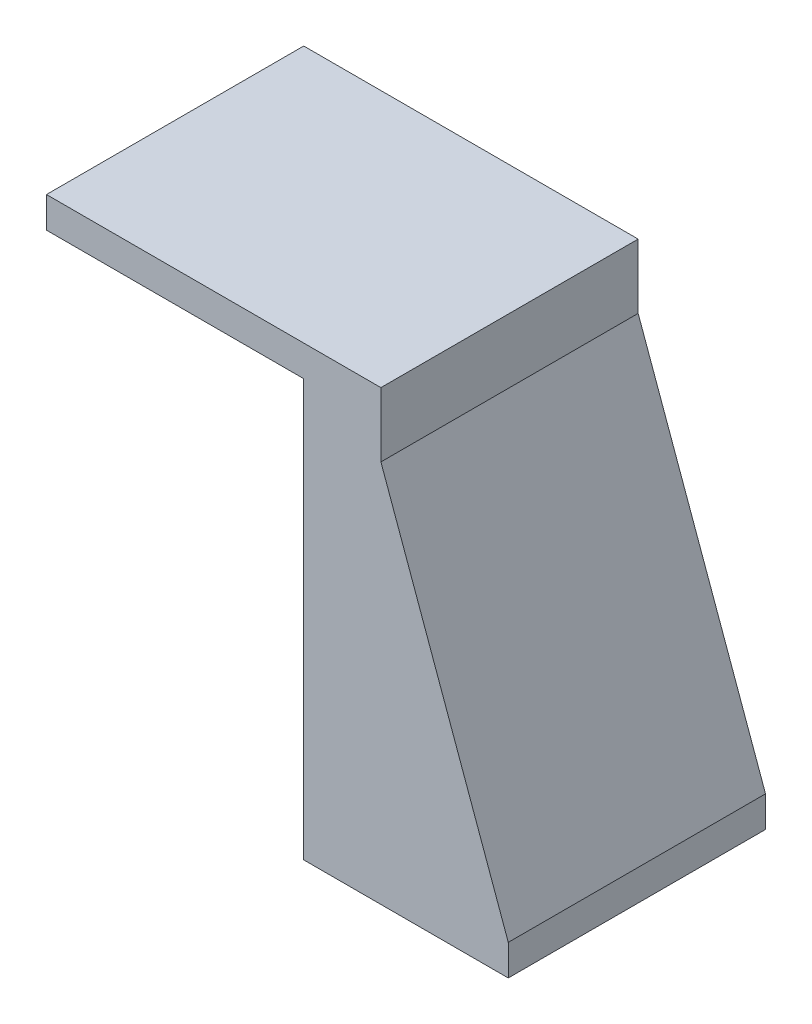
ISO-10303-21;
HEADER;
FILE_DESCRIPTION(('STEP AP214'),'2;1');
FILE_NAME('part.step','',(''),(''),'','','');
FILE_SCHEMA(('AUTOMOTIVE_DESIGN { 1 0 10303 214 1 1 1 1 }'));
ENDSEC;
DATA;
#1=APPLICATION_CONTEXT('core data for automotive mechanical design processes');
#2=APPLICATION_PROTOCOL_DEFINITION('international standard','automotive_design',2000,#1);
#3=PRODUCT_CONTEXT('',#1,'mechanical');
#4=PRODUCT('Part','Part','',(#3));
#5=PRODUCT_RELATED_PRODUCT_CATEGORY('part','',(#4));
#6=PRODUCT_DEFINITION_FORMATION('','',#4);
#7=PRODUCT_DEFINITION_CONTEXT('part definition',#1,'design');
#8=PRODUCT_DEFINITION('design','',#6,#7);
#9=PRODUCT_DEFINITION_SHAPE('','',#8);
#10=(LENGTH_UNIT() NAMED_UNIT(*) SI_UNIT(.MILLI.,.METRE.));
#11=(NAMED_UNIT(*) PLANE_ANGLE_UNIT() SI_UNIT($,.RADIAN.));
#12=(NAMED_UNIT(*) SI_UNIT($,.STERADIAN.) SOLID_ANGLE_UNIT());
#13=UNCERTAINTY_MEASURE_WITH_UNIT(LENGTH_MEASURE(1.E-05),#10,'distance_accuracy_value','');
#14=(GEOMETRIC_REPRESENTATION_CONTEXT(3) GLOBAL_UNCERTAINTY_ASSIGNED_CONTEXT((#13)) GLOBAL_UNIT_ASSIGNED_CONTEXT((#10,
#11,#12)) REPRESENTATION_CONTEXT('',''));
#15=CARTESIAN_POINT('',(0.,0.,0.));
#16=DIRECTION('',(0.,0.,1.));
#17=DIRECTION('',(1.,0.,0.));
#18=AXIS2_PLACEMENT_3D('',#15,#16,#17);
#19=CARTESIAN_POINT('',(25.244480702304,2.31255703292632,50.));
#20=DIRECTION('',(1.,0.,0.));
#21=DIRECTION('',(0.,0.,-1.));
#22=AXIS2_PLACEMENT_3D('',#19,#20,#21);
#23=PLANE('',#22);
#24=DIRECTION('',(0.,-1.,0.));
#25=VECTOR('',#24,1.);
#26=CARTESIAN_POINT('',(25.244480702304,2.31255703292632,0.));
#27=LINE('',#26,#25);
#28=CARTESIAN_POINT('',(25.244480702304,83.3125570329263,0.));
#29=VERTEX_POINT('',#28);
#30=CARTESIAN_POINT('',(25.244480702304,2.31255703292632,0.));
#31=VERTEX_POINT('',#30);
#32=EDGE_CURVE('E146',#29,#31,#27,.T.);
#33=ORIENTED_EDGE('',*,*,#32,.T.);
#34=DIRECTION('',(0.,0.,-1.));
#35=VECTOR('',#34,1.);
#36=CARTESIAN_POINT('',(25.244480702304,2.31255703292632,50.));
#37=LINE('',#36,#35);
#38=CARTESIAN_POINT('',(25.244480702304,2.31255703292632,50.));
#39=VERTEX_POINT('',#38);
#40=EDGE_CURVE('E11',#39,#31,#37,.T.);
#41=ORIENTED_EDGE('',*,*,#40,.F.);
#42=DIRECTION('',(0.,-1.,0.));
#43=VECTOR('',#42,1.);
#44=CARTESIAN_POINT('',(25.244480702304,2.31255703292632,50.));
#45=LINE('',#44,#43);
#46=CARTESIAN_POINT('',(25.244480702304,83.3125570329263,50.));
#47=VERTEX_POINT('',#46);
#48=EDGE_CURVE('E168',#47,#39,#45,.T.);
#49=ORIENTED_EDGE('',*,*,#48,.F.);
#50=DIRECTION('',(0.,0.,-1.));
#51=VECTOR('',#50,1.);
#52=CARTESIAN_POINT('',(25.244480702304,83.3125570329263,50.));
#53=LINE('',#52,#51);
#54=EDGE_CURVE('E142',#47,#29,#53,.T.);
#55=ORIENTED_EDGE('',*,*,#54,.T.);
#56=EDGE_LOOP('',(#33,#41,#49,#55));
#57=FACE_BOUND('',#56,.T.);
#58=ADVANCED_FACE('F45',(#57),#23,.F.);
#59=CARTESIAN_POINT('',(25.244480702304,2.31255703292632,50.));
#60=DIRECTION('',(0.,1.,0.));
#61=DIRECTION('',(0.,0.,1.));
#62=AXIS2_PLACEMENT_3D('',#59,#60,#61);
#63=PLANE('',#62);
#64=DIRECTION('',(1.,0.,0.));
#65=VECTOR('',#64,1.);
#66=CARTESIAN_POINT('',(25.244480702304,2.31255703292632,0.));
#67=LINE('',#66,#65);
#68=CARTESIAN_POINT('',(65.,2.31255703292632,0.));
#69=VERTEX_POINT('',#68);
#70=EDGE_CURVE('E150',#31,#69,#67,.T.);
#71=ORIENTED_EDGE('',*,*,#70,.T.);
#72=DIRECTION('',(0.,0.,-1.));
#73=VECTOR('',#72,1.);
#74=CARTESIAN_POINT('',(65.,2.31255703292632,50.));
#75=LINE('',#74,#73);
#76=CARTESIAN_POINT('',(65.,2.31255703292632,50.));
#77=VERTEX_POINT('',#76);
#78=EDGE_CURVE('E54',#77,#69,#75,.T.);
#79=ORIENTED_EDGE('',*,*,#78,.F.);
#80=DIRECTION('',(1.,0.,0.));
#81=VECTOR('',#80,1.);
#82=CARTESIAN_POINT('',(25.244480702304,2.31255703292632,50.));
#83=LINE('',#82,#81);
#84=EDGE_CURVE('E105',#39,#77,#83,.T.);
#85=ORIENTED_EDGE('',*,*,#84,.F.);
#86=ORIENTED_EDGE('',*,*,#40,.T.);
#87=EDGE_LOOP('',(#71,#79,#85,#86));
#88=FACE_BOUND('',#87,.T.);
#89=ADVANCED_FACE('F214',(#88),#63,.F.);
#90=CARTESIAN_POINT('',(65.,8.31255703292632,50.));
#91=DIRECTION('',(-1.,0.,0.));
#92=DIRECTION('',(0.,0.,1.));
#93=AXIS2_PLACEMENT_3D('',#90,#91,#92);
#94=PLANE('',#93);
#95=DIRECTION('',(0.,1.,0.));
#96=VECTOR('',#95,1.);
#97=CARTESIAN_POINT('',(65.,8.31255703292632,0.));
#98=LINE('',#97,#96);
#99=CARTESIAN_POINT('',(65.,8.31255703292632,0.));
#100=VERTEX_POINT('',#99);
#101=EDGE_CURVE('E153',#69,#100,#98,.T.);
#102=ORIENTED_EDGE('',*,*,#101,.T.);
#103=DIRECTION('',(0.,0.,-1.));
#104=VECTOR('',#103,1.);
#105=CARTESIAN_POINT('',(65.,8.31255703292632,50.));
#106=LINE('',#105,#104);
#107=CARTESIAN_POINT('',(65.,8.31255703292632,50.));
#108=VERTEX_POINT('',#107);
#109=EDGE_CURVE('E179',#108,#100,#106,.T.);
#110=ORIENTED_EDGE('',*,*,#109,.F.);
#111=DIRECTION('',(0.,1.,0.));
#112=VECTOR('',#111,1.);
#113=CARTESIAN_POINT('',(65.,8.31255703292632,50.));
#114=LINE('',#113,#112);
#115=EDGE_CURVE('E189',#77,#108,#114,.T.);
#116=ORIENTED_EDGE('',*,*,#115,.F.);
#117=ORIENTED_EDGE('',*,*,#78,.T.);
#118=EDGE_LOOP('',(#102,#110,#116,#117));
#119=FACE_BOUND('',#118,.T.);
#120=ADVANCED_FACE('F187',(#119),#94,.F.);
#121=CARTESIAN_POINT('',(40.244480702304,76.8035738067253,50.));
#122=DIRECTION('',(-0.940454497189142,-0.33991960625524,0.));
#123=DIRECTION('',(0.33991960625524,-0.940454497189142,0.));
#124=AXIS2_PLACEMENT_3D('',#121,#122,#123);
#125=PLANE('',#124);
#126=DIRECTION('',(-0.33991960625524,0.940454497189142,0.));
#127=VECTOR('',#126,1.);
#128=CARTESIAN_POINT('',(40.244480702304,76.8035738067253,0.));
#129=LINE('',#128,#127);
#130=CARTESIAN_POINT('',(40.244480702304,76.8035738067253,0.));
#131=VERTEX_POINT('',#130);
#132=EDGE_CURVE('E156',#100,#131,#129,.T.);
#133=ORIENTED_EDGE('',*,*,#132,.T.);
#134=DIRECTION('',(0.,0.,-1.));
#135=VECTOR('',#134,1.);
#136=CARTESIAN_POINT('',(40.244480702304,76.8035738067253,50.));
#137=LINE('',#136,#135);
#138=CARTESIAN_POINT('',(40.244480702304,76.8035738067253,50.));
#139=VERTEX_POINT('',#138);
#140=EDGE_CURVE('E175',#139,#131,#137,.T.);
#141=ORIENTED_EDGE('',*,*,#140,.F.);
#142=DIRECTION('',(-0.33991960625524,0.940454497189142,0.));
#143=VECTOR('',#142,1.);
#144=CARTESIAN_POINT('',(40.244480702304,76.8035738067253,50.));
#145=LINE('',#144,#143);
#146=EDGE_CURVE('E202',#108,#139,#145,.T.);
#147=ORIENTED_EDGE('',*,*,#146,.F.);
#148=ORIENTED_EDGE('',*,*,#109,.T.);
#149=EDGE_LOOP('',(#133,#141,#147,#148));
#150=FACE_BOUND('',#149,.T.);
#151=ADVANCED_FACE('F197',(#150),#125,.F.);
#152=CARTESIAN_POINT('',(40.244480702304,76.8035738067253,50.));
#153=DIRECTION('',(-1.,0.,0.));
#154=DIRECTION('',(0.,0.,1.));
#155=AXIS2_PLACEMENT_3D('',#152,#153,#154);
#156=PLANE('',#155);
#157=DIRECTION('',(0.,1.,0.));
#158=VECTOR('',#157,1.);
#159=CARTESIAN_POINT('',(40.244480702304,76.8035738067253,0.));
#160=LINE('',#159,#158);
#161=CARTESIAN_POINT('',(40.244480702304,89.3125570329263,0.));
#162=VERTEX_POINT('',#161);
#163=EDGE_CURVE('E159',#131,#162,#160,.T.);
#164=ORIENTED_EDGE('',*,*,#163,.T.);
#165=DIRECTION('',(0.,0.,-1.));
#166=VECTOR('',#165,1.);
#167=CARTESIAN_POINT('',(40.244480702304,89.3125570329263,50.));
#168=LINE('',#167,#166);
#169=CARTESIAN_POINT('',(40.244480702304,89.3125570329263,50.));
#170=VERTEX_POINT('',#169);
#171=EDGE_CURVE('E135',#170,#162,#168,.T.);
#172=ORIENTED_EDGE('',*,*,#171,.F.);
#173=DIRECTION('',(0.,1.,0.));
#174=VECTOR('',#173,1.);
#175=CARTESIAN_POINT('',(40.244480702304,76.8035738067253,50.));
#176=LINE('',#175,#174);
#177=EDGE_CURVE('E124',#139,#170,#176,.T.);
#178=ORIENTED_EDGE('',*,*,#177,.F.);
#179=ORIENTED_EDGE('',*,*,#140,.T.);
#180=EDGE_LOOP('',(#164,#172,#178,#179));
#181=FACE_BOUND('',#180,.T.);
#182=ADVANCED_FACE('F200',(#181),#156,.F.);
#183=CARTESIAN_POINT('',(-24.755519297696,89.3125570329263,50.));
#184=DIRECTION('',(0.,-1.,0.));
#185=DIRECTION('',(0.,0.,-1.));
#186=AXIS2_PLACEMENT_3D('',#183,#184,#185);
#187=PLANE('',#186);
#188=DIRECTION('',(-1.,0.,0.));
#189=VECTOR('',#188,1.);
#190=CARTESIAN_POINT('',(-24.755519297696,89.3125570329263,0.));
#191=LINE('',#190,#189);
#192=CARTESIAN_POINT('',(-24.755519297696,89.3125570329263,0.));
#193=VERTEX_POINT('',#192);
#194=EDGE_CURVE('E133',#162,#193,#191,.T.);
#195=ORIENTED_EDGE('',*,*,#194,.T.);
#196=DIRECTION('',(0.,0.,-1.));
#197=VECTOR('',#196,1.);
#198=CARTESIAN_POINT('',(-24.755519297696,89.3125570329263,50.));
#199=LINE('',#198,#197);
#200=CARTESIAN_POINT('',(-24.755519297696,89.3125570329263,50.));
#201=VERTEX_POINT('',#200);
#202=EDGE_CURVE('E130',#201,#193,#199,.T.);
#203=ORIENTED_EDGE('',*,*,#202,.F.);
#204=DIRECTION('',(-1.,0.,0.));
#205=VECTOR('',#204,1.);
#206=CARTESIAN_POINT('',(-24.755519297696,89.3125570329263,50.));
#207=LINE('',#206,#205);
#208=EDGE_CURVE('E118',#170,#201,#207,.T.);
#209=ORIENTED_EDGE('',*,*,#208,.F.);
#210=ORIENTED_EDGE('',*,*,#171,.T.);
#211=EDGE_LOOP('',(#195,#203,#209,#210));
#212=FACE_BOUND('',#211,.T.);
#213=ADVANCED_FACE('F131',(#212),#187,.F.);
#214=CARTESIAN_POINT('',(-24.755519297696,89.3125570329263,50.));
#215=DIRECTION('',(1.,0.,0.));
#216=DIRECTION('',(0.,0.,-1.));
#217=AXIS2_PLACEMENT_3D('',#214,#215,#216);
#218=PLANE('',#217);
#219=DIRECTION('',(0.,-1.,0.));
#220=VECTOR('',#219,1.);
#221=CARTESIAN_POINT('',(-24.755519297696,89.3125570329263,0.));
#222=LINE('',#221,#220);
#223=CARTESIAN_POINT('',(-24.755519297696,83.3125570329263,0.));
#224=VERTEX_POINT('',#223);
#225=EDGE_CURVE('E91',#193,#224,#222,.T.);
#226=ORIENTED_EDGE('',*,*,#225,.T.);
#227=DIRECTION('',(0.,0.,-1.));
#228=VECTOR('',#227,1.);
#229=CARTESIAN_POINT('',(-24.755519297696,83.3125570329263,50.));
#230=LINE('',#229,#228);
#231=CARTESIAN_POINT('',(-24.755519297696,83.3125570329263,50.));
#232=VERTEX_POINT('',#231);
#233=EDGE_CURVE('E136',#232,#224,#230,.T.);
#234=ORIENTED_EDGE('',*,*,#233,.F.);
#235=DIRECTION('',(0.,-1.,0.));
#236=VECTOR('',#235,1.);
#237=CARTESIAN_POINT('',(-24.755519297696,89.3125570329263,50.));
#238=LINE('',#237,#236);
#239=EDGE_CURVE('E122',#201,#232,#238,.T.);
#240=ORIENTED_EDGE('',*,*,#239,.F.);
#241=ORIENTED_EDGE('',*,*,#202,.T.);
#242=EDGE_LOOP('',(#226,#234,#240,#241));
#243=FACE_BOUND('',#242,.T.);
#244=ADVANCED_FACE('F138',(#243),#218,.F.);
#245=CARTESIAN_POINT('',(25.244480702304,83.3125570329263,50.));
#246=DIRECTION('',(0.,1.,0.));
#247=DIRECTION('',(0.,0.,1.));
#248=AXIS2_PLACEMENT_3D('',#245,#246,#247);
#249=PLANE('',#248);
#250=DIRECTION('',(1.,0.,0.));
#251=VECTOR('',#250,1.);
#252=CARTESIAN_POINT('',(25.244480702304,83.3125570329263,0.));
#253=LINE('',#252,#251);
#254=EDGE_CURVE('E97',#224,#29,#253,.T.);
#255=ORIENTED_EDGE('',*,*,#254,.T.);
#256=ORIENTED_EDGE('',*,*,#54,.F.);
#257=DIRECTION('',(1.,0.,0.));
#258=VECTOR('',#257,1.);
#259=CARTESIAN_POINT('',(25.244480702304,83.3125570329263,50.));
#260=LINE('',#259,#258);
#261=EDGE_CURVE('E62',#232,#47,#260,.T.);
#262=ORIENTED_EDGE('',*,*,#261,.F.);
#263=ORIENTED_EDGE('',*,*,#233,.T.);
#264=EDGE_LOOP('',(#255,#256,#262,#263));
#265=FACE_BOUND('',#264,.T.);
#266=ADVANCED_FACE('F230',(#265),#249,.F.);
#267=CARTESIAN_POINT('',(0.,0.,50.));
#268=DIRECTION('',(0.,0.,1.));
#269=DIRECTION('',(1.,0.,0.));
#270=AXIS2_PLACEMENT_3D('',#267,#268,#269);
#271=PLANE('',#270);
#272=ORIENTED_EDGE('',*,*,#48,.T.);
#273=ORIENTED_EDGE('',*,*,#84,.T.);
#274=ORIENTED_EDGE('',*,*,#115,.T.);
#275=ORIENTED_EDGE('',*,*,#146,.T.);
#276=ORIENTED_EDGE('',*,*,#177,.T.);
#277=ORIENTED_EDGE('',*,*,#208,.T.);
#278=ORIENTED_EDGE('',*,*,#239,.T.);
#279=ORIENTED_EDGE('',*,*,#261,.T.);
#280=EDGE_LOOP('',(#272,#273,#274,#275,#276,#277,#278,#279));
#281=FACE_BOUND('',#280,.T.);
#282=ADVANCED_FACE('F120',(#281),#271,.T.);
#283=CARTESIAN_POINT('',(0.,0.,0.));
#284=DIRECTION('',(0.,0.,1.));
#285=DIRECTION('',(1.,0.,0.));
#286=AXIS2_PLACEMENT_3D('',#283,#284,#285);
#287=PLANE('',#286);
#288=ORIENTED_EDGE('',*,*,#32,.F.);
#289=ORIENTED_EDGE('',*,*,#254,.F.);
#290=ORIENTED_EDGE('',*,*,#225,.F.);
#291=ORIENTED_EDGE('',*,*,#194,.F.);
#292=ORIENTED_EDGE('',*,*,#163,.F.);
#293=ORIENTED_EDGE('',*,*,#132,.F.);
#294=ORIENTED_EDGE('',*,*,#101,.F.);
#295=ORIENTED_EDGE('',*,*,#70,.F.);
#296=EDGE_LOOP('',(#288,#289,#290,#291,#292,#293,#294,#295));
#297=FACE_BOUND('',#296,.T.);
#298=ADVANCED_FACE('F193',(#297),#287,.F.);
#299=CLOSED_SHELL('',(#58,#89,#120,#151,#182,#213,#244,#266,#282,#298));
#300=MANIFOLD_SOLID_BREP('B2',#299);
#301=ADVANCED_BREP_SHAPE_REPRESENTATION('',(#18,#300),#14);
#302=SHAPE_DEFINITION_REPRESENTATION(#9,#301);
ENDSEC;
END-ISO-10303-21;
